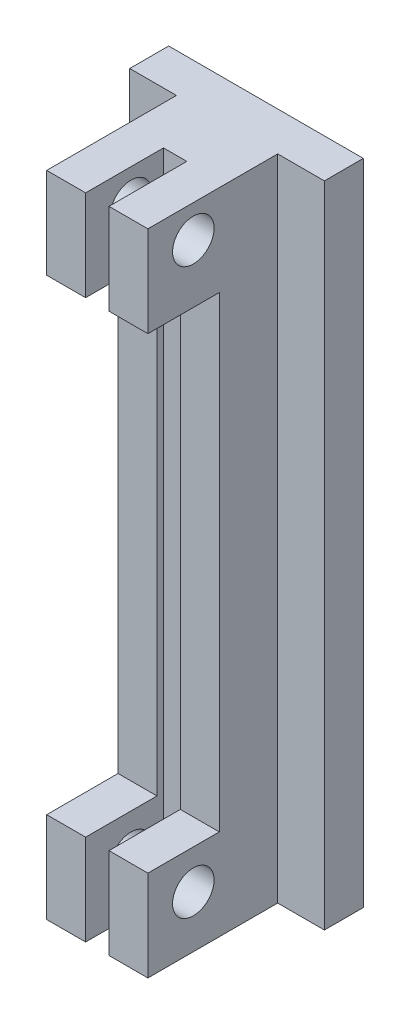
ISO-10303-21;
HEADER;
FILE_DESCRIPTION(('STEP AP214'),'2;1');
FILE_NAME('part.step','',(''),(''),'','','');
FILE_SCHEMA(('AUTOMOTIVE_DESIGN { 1 0 10303 214 1 1 1 1 }'));
ENDSEC;
DATA;
#1=APPLICATION_CONTEXT('core data for automotive mechanical design processes');
#2=APPLICATION_PROTOCOL_DEFINITION('international standard','automotive_design',2000,#1);
#3=PRODUCT_CONTEXT('',#1,'mechanical');
#4=PRODUCT('Part','Part','',(#3));
#5=PRODUCT_RELATED_PRODUCT_CATEGORY('part','',(#4));
#6=PRODUCT_DEFINITION_FORMATION('','',#4);
#7=PRODUCT_DEFINITION_CONTEXT('part definition',#1,'design');
#8=PRODUCT_DEFINITION('design','',#6,#7);
#9=PRODUCT_DEFINITION_SHAPE('','',#8);
#10=(LENGTH_UNIT() NAMED_UNIT(*) SI_UNIT(.MILLI.,.METRE.));
#11=(NAMED_UNIT(*) PLANE_ANGLE_UNIT() SI_UNIT($,.RADIAN.));
#12=(NAMED_UNIT(*) SI_UNIT($,.STERADIAN.) SOLID_ANGLE_UNIT());
#13=UNCERTAINTY_MEASURE_WITH_UNIT(LENGTH_MEASURE(1.E-05),#10,'distance_accuracy_value','');
#14=(GEOMETRIC_REPRESENTATION_CONTEXT(3) GLOBAL_UNCERTAINTY_ASSIGNED_CONTEXT((#13)) GLOBAL_UNIT_ASSIGNED_CONTEXT((#10,
#11,#12)) REPRESENTATION_CONTEXT('',''));
#15=CARTESIAN_POINT('',(0.,0.,0.));
#16=DIRECTION('',(0.,0.,1.));
#17=DIRECTION('',(1.,0.,0.));
#18=AXIS2_PLACEMENT_3D('',#15,#16,#17);
#19=CARTESIAN_POINT('',(-3.9,25.,13.));
#20=DIRECTION('',(0.,0.,-1.));
#21=DIRECTION('',(-1.,0.,0.));
#22=AXIS2_PLACEMENT_3D('',#19,#20,#21);
#23=PLANE('',#22);
#24=DIRECTION('',(0.,-1.,0.));
#25=VECTOR('',#24,1.);
#26=CARTESIAN_POINT('',(-0.900000000000001,25.,13.));
#27=LINE('',#26,#25);
#28=CARTESIAN_POINT('',(-0.900000000000001,-18.,13.));
#29=VERTEX_POINT('',#28);
#30=CARTESIAN_POINT('',(-0.900000000000001,-25.,13.));
#31=VERTEX_POINT('',#30);
#32=EDGE_CURVE('E412',#29,#31,#27,.T.);
#33=ORIENTED_EDGE('',*,*,#32,.F.);
#34=DIRECTION('',(-1.,0.,0.));
#35=VECTOR('',#34,1.);
#36=CARTESIAN_POINT('',(7.5,-18.,13.));
#37=LINE('',#36,#35);
#38=CARTESIAN_POINT('',(-3.89999999999999,-18.,13.));
#39=VERTEX_POINT('',#38);
#40=EDGE_CURVE('E270',#29,#39,#37,.T.);
#41=ORIENTED_EDGE('',*,*,#40,.T.);
#42=DIRECTION('',(0.,-1.,0.));
#43=VECTOR('',#42,1.);
#44=CARTESIAN_POINT('',(-3.9,25.,13.));
#45=LINE('',#44,#43);
#46=CARTESIAN_POINT('',(-3.9,-25.,13.));
#47=VERTEX_POINT('',#46);
#48=EDGE_CURVE('E215',#39,#47,#45,.T.);
#49=ORIENTED_EDGE('',*,*,#48,.T.);
#50=DIRECTION('',(1.,0.,0.));
#51=VECTOR('',#50,1.);
#52=CARTESIAN_POINT('',(-3.9,-25.,13.));
#53=LINE('',#52,#51);
#54=EDGE_CURVE('E352',#47,#31,#53,.T.);
#55=ORIENTED_EDGE('',*,*,#54,.T.);
#56=EDGE_LOOP('',(#33,#41,#49,#55));
#57=FACE_BOUND('',#56,.T.);
#58=ADVANCED_FACE('F45',(#57),#23,.F.);
#59=CARTESIAN_POINT('',(0.900000000000004,25.,13.));
#60=DIRECTION('',(0.,0.,-1.));
#61=DIRECTION('',(-1.,0.,0.));
#62=AXIS2_PLACEMENT_3D('',#59,#60,#61);
#63=PLANE('',#62);
#64=DIRECTION('',(0.,-1.,0.));
#65=VECTOR('',#64,1.);
#66=CARTESIAN_POINT('',(3.9,25.,13.));
#67=LINE('',#66,#65);
#68=CARTESIAN_POINT('',(3.9,-18.,13.));
#69=VERTEX_POINT('',#68);
#70=CARTESIAN_POINT('',(3.9,-25.,13.));
#71=VERTEX_POINT('',#70);
#72=EDGE_CURVE('E396',#69,#71,#67,.T.);
#73=ORIENTED_EDGE('',*,*,#72,.F.);
#74=CARTESIAN_POINT('',(0.900000000000004,-18.,13.));
#75=VERTEX_POINT('',#74);
#76=EDGE_CURVE('E274',#69,#75,#37,.T.);
#77=ORIENTED_EDGE('',*,*,#76,.T.);
#78=DIRECTION('',(0.,-1.,0.));
#79=VECTOR('',#78,1.);
#80=CARTESIAN_POINT('',(0.900000000000004,25.,13.));
#81=LINE('',#80,#79);
#82=CARTESIAN_POINT('',(0.900000000000004,-25.,13.));
#83=VERTEX_POINT('',#82);
#84=EDGE_CURVE('E401',#75,#83,#81,.T.);
#85=ORIENTED_EDGE('',*,*,#84,.T.);
#86=DIRECTION('',(1.,0.,0.));
#87=VECTOR('',#86,1.);
#88=CARTESIAN_POINT('',(0.900000000000004,-25.,13.));
#89=LINE('',#88,#87);
#90=EDGE_CURVE('E366',#83,#71,#89,.T.);
#91=ORIENTED_EDGE('',*,*,#90,.T.);
#92=EDGE_LOOP('',(#73,#77,#85,#91));
#93=FACE_BOUND('',#92,.T.);
#94=ADVANCED_FACE('F455',(#93),#63,.F.);
#95=CARTESIAN_POINT('',(-7.5,25.,0.));
#96=DIRECTION('',(1.,0.,0.));
#97=DIRECTION('',(0.,0.,-1.));
#98=AXIS2_PLACEMENT_3D('',#95,#96,#97);
#99=PLANE('',#98);
#100=DIRECTION('',(0.,0.,1.));
#101=VECTOR('',#100,1.);
#102=CARTESIAN_POINT('',(-7.5,-25.,0.));
#103=LINE('',#102,#101);
#104=CARTESIAN_POINT('',(-7.5,-25.,0.));
#105=VERTEX_POINT('',#104);
#106=CARTESIAN_POINT('',(-7.5,-25.,3.));
#107=VERTEX_POINT('',#106);
#108=EDGE_CURVE('E303',#105,#107,#103,.T.);
#109=ORIENTED_EDGE('',*,*,#108,.T.);
#110=DIRECTION('',(0.,-1.,0.));
#111=VECTOR('',#110,1.);
#112=CARTESIAN_POINT('',(-7.5,25.,3.));
#113=LINE('',#112,#111);
#114=CARTESIAN_POINT('',(-7.5,25.,3.));
#115=VERTEX_POINT('',#114);
#116=EDGE_CURVE('E220',#115,#107,#113,.T.);
#117=ORIENTED_EDGE('',*,*,#116,.F.);
#118=DIRECTION('',(0.,0.,1.));
#119=VECTOR('',#118,1.);
#120=CARTESIAN_POINT('',(-7.5,25.,0.));
#121=LINE('',#120,#119);
#122=CARTESIAN_POINT('',(-7.5,25.,0.));
#123=VERTEX_POINT('',#122);
#124=EDGE_CURVE('E304',#123,#115,#121,.T.);
#125=ORIENTED_EDGE('',*,*,#124,.F.);
#126=DIRECTION('',(0.,-1.,0.));
#127=VECTOR('',#126,1.);
#128=CARTESIAN_POINT('',(-7.5,25.,0.));
#129=LINE('',#128,#127);
#130=EDGE_CURVE('E341',#123,#105,#129,.T.);
#131=ORIENTED_EDGE('',*,*,#130,.T.);
#132=EDGE_LOOP('',(#109,#117,#125,#131));
#133=FACE_BOUND('',#132,.T.);
#134=ADVANCED_FACE('F47',(#133),#99,.F.);
#135=CARTESIAN_POINT('',(-7.5,25.,3.));
#136=DIRECTION('',(0.,0.,-1.));
#137=DIRECTION('',(-1.,0.,0.));
#138=AXIS2_PLACEMENT_3D('',#135,#136,#137);
#139=PLANE('',#138);
#140=DIRECTION('',(1.,0.,0.));
#141=VECTOR('',#140,1.);
#142=CARTESIAN_POINT('',(-7.5,-25.,3.));
#143=LINE('',#142,#141);
#144=CARTESIAN_POINT('',(-3.9,-25.,3.));
#145=VERTEX_POINT('',#144);
#146=EDGE_CURVE('E345',#107,#145,#143,.T.);
#147=ORIENTED_EDGE('',*,*,#146,.T.);
#148=DIRECTION('',(0.,-1.,0.));
#149=VECTOR('',#148,1.);
#150=CARTESIAN_POINT('',(-3.9,25.,3.));
#151=LINE('',#150,#149);
#152=CARTESIAN_POINT('',(-3.9,25.,3.));
#153=VERTEX_POINT('',#152);
#154=EDGE_CURVE('E214',#153,#145,#151,.T.);
#155=ORIENTED_EDGE('',*,*,#154,.F.);
#156=DIRECTION('',(1.,0.,0.));
#157=VECTOR('',#156,1.);
#158=CARTESIAN_POINT('',(-7.5,25.,3.));
#159=LINE('',#158,#157);
#160=EDGE_CURVE('E308',#115,#153,#159,.T.);
#161=ORIENTED_EDGE('',*,*,#160,.F.);
#162=ORIENTED_EDGE('',*,*,#116,.T.);
#163=EDGE_LOOP('',(#147,#155,#161,#162));
#164=FACE_BOUND('',#163,.T.);
#165=ADVANCED_FACE('F474',(#164),#139,.F.);
#166=CARTESIAN_POINT('',(-3.9,25.,3.));
#167=DIRECTION('',(1.,0.,0.));
#168=DIRECTION('',(0.,0.,-1.));
#169=AXIS2_PLACEMENT_3D('',#166,#167,#168);
#170=PLANE('',#169);
#171=CARTESIAN_POINT('',(-3.9,22.5,9.50000000000001));
#172=DIRECTION('',(-1.,0.,0.));
#173=DIRECTION('',(0.,0.,1.));
#174=AXIS2_PLACEMENT_3D('',#171,#172,#173);
#175=CIRCLE('',#174,1.6);
#176=CARTESIAN_POINT('',(-3.9,22.5,11.1));
#177=VERTEX_POINT('',#176);
#178=EDGE_CURVE('E239',#177,#177,#175,.T.);
#179=ORIENTED_EDGE('',*,*,#178,.F.);
#180=EDGE_LOOP('',(#179));
#181=FACE_BOUND('',#180,.T.);
#182=CARTESIAN_POINT('',(-3.9,-21.,9.50000000000001));
#183=DIRECTION('',(-1.,0.,0.));
#184=DIRECTION('',(0.,0.,1.));
#185=AXIS2_PLACEMENT_3D('',#182,#183,#184);
#186=CIRCLE('',#185,1.6);
#187=CARTESIAN_POINT('',(-3.9,-21.,11.1));
#188=VERTEX_POINT('',#187);
#189=EDGE_CURVE('E248',#188,#188,#186,.T.);
#190=ORIENTED_EDGE('',*,*,#189,.F.);
#191=EDGE_LOOP('',(#190));
#192=FACE_BOUND('',#191,.T.);
#193=ORIENTED_EDGE('',*,*,#48,.F.);
#194=DIRECTION('',(0.,0.,1.));
#195=VECTOR('',#194,1.);
#196=CARTESIAN_POINT('',(-3.89999999999999,-18.,13.));
#197=LINE('',#196,#195);
#198=CARTESIAN_POINT('',(-3.9,-18.,7.5));
#199=VERTEX_POINT('',#198);
#200=EDGE_CURVE('E196',#199,#39,#197,.T.);
#201=ORIENTED_EDGE('',*,*,#200,.F.);
#202=DIRECTION('',(0.,-1.,0.));
#203=VECTOR('',#202,1.);
#204=CARTESIAN_POINT('',(-3.9,-18.,7.5));
#205=LINE('',#204,#203);
#206=CARTESIAN_POINT('',(-3.9,18.,7.49999999999999));
#207=VERTEX_POINT('',#206);
#208=EDGE_CURVE('E207',#207,#199,#205,.T.);
#209=ORIENTED_EDGE('',*,*,#208,.F.);
#210=DIRECTION('',(0.,0.,-1.));
#211=VECTOR('',#210,1.);
#212=CARTESIAN_POINT('',(-3.89999999999999,18.,13.));
#213=LINE('',#212,#211);
#214=CARTESIAN_POINT('',(-3.89999999999999,18.,13.));
#215=VERTEX_POINT('',#214);
#216=EDGE_CURVE('E186',#215,#207,#213,.T.);
#217=ORIENTED_EDGE('',*,*,#216,.F.);
#218=CARTESIAN_POINT('',(-3.9,25.,13.));
#219=VERTEX_POINT('',#218);
#220=EDGE_CURVE('E203',#219,#215,#45,.T.);
#221=ORIENTED_EDGE('',*,*,#220,.F.);
#222=DIRECTION('',(0.,0.,1.));
#223=VECTOR('',#222,1.);
#224=CARTESIAN_POINT('',(-3.9,25.,3.));
#225=LINE('',#224,#223);
#226=EDGE_CURVE('E312',#153,#219,#225,.T.);
#227=ORIENTED_EDGE('',*,*,#226,.F.);
#228=ORIENTED_EDGE('',*,*,#154,.T.);
#229=DIRECTION('',(0.,0.,1.));
#230=VECTOR('',#229,1.);
#231=CARTESIAN_POINT('',(-3.9,-25.,3.));
#232=LINE('',#231,#230);
#233=EDGE_CURVE('E348',#145,#47,#232,.T.);
#234=ORIENTED_EDGE('',*,*,#233,.T.);
#235=EDGE_LOOP('',(#193,#201,#209,#217,#221,#227,#228,#234));
#236=FACE_BOUND('',#235,.T.);
#237=ADVANCED_FACE('F201',(#181,#192,#236),#170,.F.);
#238=ORIENTED_EDGE('',*,*,#220,.T.);
#239=DIRECTION('',(-1.,0.,0.));
#240=VECTOR('',#239,1.);
#241=CARTESIAN_POINT('',(7.5,18.,13.));
#242=LINE('',#241,#240);
#243=CARTESIAN_POINT('',(-0.900000000000001,18.,13.));
#244=VERTEX_POINT('',#243);
#245=EDGE_CURVE('E183',#244,#215,#242,.T.);
#246=ORIENTED_EDGE('',*,*,#245,.F.);
#247=CARTESIAN_POINT('',(-0.900000000000001,25.,13.));
#248=VERTEX_POINT('',#247);
#249=EDGE_CURVE('E222',#248,#244,#27,.T.);
#250=ORIENTED_EDGE('',*,*,#249,.F.);
#251=DIRECTION('',(1.,0.,0.));
#252=VECTOR('',#251,1.);
#253=CARTESIAN_POINT('',(-3.9,25.,13.));
#254=LINE('',#253,#252);
#255=EDGE_CURVE('E212',#219,#248,#254,.T.);
#256=ORIENTED_EDGE('',*,*,#255,.F.);
#257=EDGE_LOOP('',(#238,#246,#250,#256));
#258=FACE_BOUND('',#257,.T.);
#259=ADVANCED_FACE('F211',(#258),#23,.F.);
#260=CARTESIAN_POINT('',(-0.900000000000001,25.,13.));
#261=DIRECTION('',(-1.,0.,0.));
#262=DIRECTION('',(0.,0.,1.));
#263=AXIS2_PLACEMENT_3D('',#260,#261,#262);
#264=PLANE('',#263);
#265=CARTESIAN_POINT('',(-0.9,22.5,9.50000000000001));
#266=DIRECTION('',(-1.,0.,0.));
#267=DIRECTION('',(0.,0.,1.));
#268=AXIS2_PLACEMENT_3D('',#265,#266,#267);
#269=CIRCLE('',#268,1.6);
#270=CARTESIAN_POINT('',(-0.9,22.5,11.1));
#271=VERTEX_POINT('',#270);
#272=EDGE_CURVE('E209',#271,#271,#269,.T.);
#273=ORIENTED_EDGE('',*,*,#272,.T.);
#274=EDGE_LOOP('',(#273));
#275=FACE_BOUND('',#274,.T.);
#276=CARTESIAN_POINT('',(-0.9,-21.,9.50000000000001));
#277=DIRECTION('',(-1.,0.,0.));
#278=DIRECTION('',(0.,0.,1.));
#279=AXIS2_PLACEMENT_3D('',#276,#277,#278);
#280=CIRCLE('',#279,1.6);
#281=CARTESIAN_POINT('',(-0.9,-21.,11.1));
#282=VERTEX_POINT('',#281);
#283=EDGE_CURVE('E245',#282,#282,#280,.T.);
#284=ORIENTED_EDGE('',*,*,#283,.T.);
#285=EDGE_LOOP('',(#284));
#286=FACE_BOUND('',#285,.T.);
#287=DIRECTION('',(0.,-1.,0.));
#288=VECTOR('',#287,1.);
#289=CARTESIAN_POINT('',(-0.9,25.,7.49999999999999));
#290=LINE('',#289,#288);
#291=CARTESIAN_POINT('',(-0.9,18.,7.49999999999999));
#292=VERTEX_POINT('',#291);
#293=CARTESIAN_POINT('',(-0.9,-18.,7.5));
#294=VERTEX_POINT('',#293);
#295=EDGE_CURVE('E291',#292,#294,#290,.T.);
#296=ORIENTED_EDGE('',*,*,#295,.T.);
#297=DIRECTION('',(0.,0.,1.));
#298=VECTOR('',#297,1.);
#299=CARTESIAN_POINT('',(-0.900000000000001,-18.,13.));
#300=LINE('',#299,#298);
#301=EDGE_CURVE('E299',#294,#29,#300,.T.);
#302=ORIENTED_EDGE('',*,*,#301,.T.);
#303=ORIENTED_EDGE('',*,*,#32,.T.);
#304=DIRECTION('',(0.,0.,-1.));
#305=VECTOR('',#304,1.);
#306=CARTESIAN_POINT('',(-0.900000000000001,-25.,13.));
#307=LINE('',#306,#305);
#308=CARTESIAN_POINT('',(-0.9,-25.,7.));
#309=VERTEX_POINT('',#308);
#310=EDGE_CURVE('E356',#31,#309,#307,.T.);
#311=ORIENTED_EDGE('',*,*,#310,.T.);
#312=DIRECTION('',(0.,-1.,0.));
#313=VECTOR('',#312,1.);
#314=CARTESIAN_POINT('',(-0.9,25.,7.));
#315=LINE('',#314,#313);
#316=CARTESIAN_POINT('',(-0.9,25.,7.));
#317=VERTEX_POINT('',#316);
#318=EDGE_CURVE('E409',#317,#309,#315,.T.);
#319=ORIENTED_EDGE('',*,*,#318,.F.);
#320=DIRECTION('',(0.,0.,-1.));
#321=VECTOR('',#320,1.);
#322=CARTESIAN_POINT('',(-0.900000000000001,25.,13.));
#323=LINE('',#322,#321);
#324=EDGE_CURVE('E317',#248,#317,#323,.T.);
#325=ORIENTED_EDGE('',*,*,#324,.F.);
#326=ORIENTED_EDGE('',*,*,#249,.T.);
#327=DIRECTION('',(0.,0.,-1.));
#328=VECTOR('',#327,1.);
#329=CARTESIAN_POINT('',(-0.900000000000001,18.,13.));
#330=LINE('',#329,#328);
#331=EDGE_CURVE('E189',#244,#292,#330,.T.);
#332=ORIENTED_EDGE('',*,*,#331,.T.);
#333=EDGE_LOOP('',(#296,#302,#303,#311,#319,#325,#326,#332));
#334=FACE_BOUND('',#333,.T.);
#335=ADVANCED_FACE('F422',(#275,#286,#334),#264,.F.);
#336=CARTESIAN_POINT('',(-0.9,25.,7.));
#337=DIRECTION('',(0.,0.,-1.));
#338=DIRECTION('',(-1.,0.,0.));
#339=AXIS2_PLACEMENT_3D('',#336,#337,#338);
#340=PLANE('',#339);
#341=DIRECTION('',(1.,0.,0.));
#342=VECTOR('',#341,1.);
#343=CARTESIAN_POINT('',(-0.9,-25.,7.));
#344=LINE('',#343,#342);
#345=CARTESIAN_POINT('',(0.899999999999999,-25.,7.));
#346=VERTEX_POINT('',#345);
#347=EDGE_CURVE('E359',#309,#346,#344,.T.);
#348=ORIENTED_EDGE('',*,*,#347,.T.);
#349=DIRECTION('',(0.,-1.,0.));
#350=VECTOR('',#349,1.);
#351=CARTESIAN_POINT('',(0.899999999999999,25.,7.));
#352=LINE('',#351,#350);
#353=CARTESIAN_POINT('',(0.899999999999999,25.,7.));
#354=VERTEX_POINT('',#353);
#355=EDGE_CURVE('E406',#354,#346,#352,.T.);
#356=ORIENTED_EDGE('',*,*,#355,.F.);
#357=DIRECTION('',(1.,0.,0.));
#358=VECTOR('',#357,1.);
#359=CARTESIAN_POINT('',(-0.9,25.,7.));
#360=LINE('',#359,#358);
#361=EDGE_CURVE('E320',#317,#354,#360,.T.);
#362=ORIENTED_EDGE('',*,*,#361,.F.);
#363=ORIENTED_EDGE('',*,*,#318,.T.);
#364=EDGE_LOOP('',(#348,#356,#362,#363));
#365=FACE_BOUND('',#364,.T.);
#366=ADVANCED_FACE('F471',(#365),#340,.F.);
#367=CARTESIAN_POINT('',(0.899999999999999,25.,7.));
#368=DIRECTION('',(1.,0.,0.));
#369=DIRECTION('',(0.,0.,-1.));
#370=AXIS2_PLACEMENT_3D('',#367,#368,#369);
#371=PLANE('',#370);
#372=CARTESIAN_POINT('',(0.900000000000001,22.5,9.50000000000001));
#373=DIRECTION('',(1.,0.,0.));
#374=DIRECTION('',(0.,0.,-1.));
#375=AXIS2_PLACEMENT_3D('',#372,#373,#374);
#376=CIRCLE('',#375,1.6);
#377=CARTESIAN_POINT('',(0.9,22.5,7.9));
#378=VERTEX_POINT('',#377);
#379=EDGE_CURVE('E259',#378,#378,#376,.T.);
#380=ORIENTED_EDGE('',*,*,#379,.T.);
#381=EDGE_LOOP('',(#380));
#382=FACE_BOUND('',#381,.T.);
#383=CARTESIAN_POINT('',(0.900000000000001,-21.,9.50000000000001));
#384=DIRECTION('',(1.,0.,0.));
#385=DIRECTION('',(0.,0.,-1.));
#386=AXIS2_PLACEMENT_3D('',#383,#384,#385);
#387=CIRCLE('',#386,1.6);
#388=CARTESIAN_POINT('',(0.9,-21.,7.90000000000001));
#389=VERTEX_POINT('',#388);
#390=EDGE_CURVE('E238',#389,#389,#387,.T.);
#391=ORIENTED_EDGE('',*,*,#390,.T.);
#392=EDGE_LOOP('',(#391));
#393=FACE_BOUND('',#392,.T.);
#394=ORIENTED_EDGE('',*,*,#84,.F.);
#395=DIRECTION('',(0.,0.,-1.));
#396=VECTOR('',#395,1.);
#397=CARTESIAN_POINT('',(0.899999999999999,-18.,7.));
#398=LINE('',#397,#396);
#399=CARTESIAN_POINT('',(0.9,-18.,7.5));
#400=VERTEX_POINT('',#399);
#401=EDGE_CURVE('E295',#75,#400,#398,.T.);
#402=ORIENTED_EDGE('',*,*,#401,.T.);
#403=DIRECTION('',(0.,1.,0.));
#404=VECTOR('',#403,1.);
#405=CARTESIAN_POINT('',(0.9,25.,7.49999999999999));
#406=LINE('',#405,#404);
#407=CARTESIAN_POINT('',(0.900000000000001,18.,7.49999999999999));
#408=VERTEX_POINT('',#407);
#409=EDGE_CURVE('E287',#400,#408,#406,.T.);
#410=ORIENTED_EDGE('',*,*,#409,.T.);
#411=DIRECTION('',(0.,0.,1.));
#412=VECTOR('',#411,1.);
#413=CARTESIAN_POINT('',(0.899999999999999,18.,7.));
#414=LINE('',#413,#412);
#415=CARTESIAN_POINT('',(0.900000000000004,18.,13.));
#416=VERTEX_POINT('',#415);
#417=EDGE_CURVE('E281',#408,#416,#414,.T.);
#418=ORIENTED_EDGE('',*,*,#417,.T.);
#419=CARTESIAN_POINT('',(0.900000000000004,25.,13.));
#420=VERTEX_POINT('',#419);
#421=EDGE_CURVE('E402',#420,#416,#81,.T.);
#422=ORIENTED_EDGE('',*,*,#421,.F.);
#423=DIRECTION('',(0.,0.,1.));
#424=VECTOR('',#423,1.);
#425=CARTESIAN_POINT('',(0.899999999999999,25.,7.));
#426=LINE('',#425,#424);
#427=EDGE_CURVE('E323',#354,#420,#426,.T.);
#428=ORIENTED_EDGE('',*,*,#427,.F.);
#429=ORIENTED_EDGE('',*,*,#355,.T.);
#430=DIRECTION('',(0.,0.,1.));
#431=VECTOR('',#430,1.);
#432=CARTESIAN_POINT('',(0.899999999999999,-25.,7.));
#433=LINE('',#432,#431);
#434=EDGE_CURVE('E362',#346,#83,#433,.T.);
#435=ORIENTED_EDGE('',*,*,#434,.T.);
#436=EDGE_LOOP('',(#394,#402,#410,#418,#422,#428,#429,#435));
#437=FACE_BOUND('',#436,.T.);
#438=ADVANCED_FACE('F504',(#382,#393,#437),#371,.F.);
#439=ORIENTED_EDGE('',*,*,#421,.T.);
#440=CARTESIAN_POINT('',(3.9,18.,13.));
#441=VERTEX_POINT('',#440);
#442=EDGE_CURVE('E195',#441,#416,#242,.T.);
#443=ORIENTED_EDGE('',*,*,#442,.F.);
#444=CARTESIAN_POINT('',(3.9,25.,13.));
#445=VERTEX_POINT('',#444);
#446=EDGE_CURVE('E397',#445,#441,#67,.T.);
#447=ORIENTED_EDGE('',*,*,#446,.F.);
#448=DIRECTION('',(1.,0.,0.));
#449=VECTOR('',#448,1.);
#450=CARTESIAN_POINT('',(0.900000000000004,25.,13.));
#451=LINE('',#450,#449);
#452=EDGE_CURVE('E326',#420,#445,#451,.T.);
#453=ORIENTED_EDGE('',*,*,#452,.F.);
#454=EDGE_LOOP('',(#439,#443,#447,#453));
#455=FACE_BOUND('',#454,.T.);
#456=ADVANCED_FACE('F463',(#455),#63,.F.);
#457=CARTESIAN_POINT('',(3.9,25.,13.));
#458=DIRECTION('',(-1.,0.,0.));
#459=DIRECTION('',(0.,0.,1.));
#460=AXIS2_PLACEMENT_3D('',#457,#458,#459);
#461=PLANE('',#460);
#462=CARTESIAN_POINT('',(3.9,22.5,9.50000000000001));
#463=DIRECTION('',(-1.,0.,0.));
#464=DIRECTION('',(0.,0.,1.));
#465=AXIS2_PLACEMENT_3D('',#462,#463,#464);
#466=CIRCLE('',#465,1.6);
#467=CARTESIAN_POINT('',(3.9,22.5,11.1));
#468=VERTEX_POINT('',#467);
#469=EDGE_CURVE('E49',#468,#468,#466,.T.);
#470=ORIENTED_EDGE('',*,*,#469,.T.);
#471=EDGE_LOOP('',(#470));
#472=FACE_BOUND('',#471,.T.);
#473=CARTESIAN_POINT('',(3.9,-21.,9.50000000000001));
#474=DIRECTION('',(-1.,0.,0.));
#475=DIRECTION('',(0.,0.,1.));
#476=AXIS2_PLACEMENT_3D('',#473,#474,#475);
#477=CIRCLE('',#476,1.6);
#478=CARTESIAN_POINT('',(3.9,-21.,11.1));
#479=VERTEX_POINT('',#478);
#480=EDGE_CURVE('E235',#479,#479,#477,.T.);
#481=ORIENTED_EDGE('',*,*,#480,.T.);
#482=EDGE_LOOP('',(#481));
#483=FACE_BOUND('',#482,.T.);
#484=DIRECTION('',(0.,-1.,0.));
#485=VECTOR('',#484,1.);
#486=CARTESIAN_POINT('',(3.9,25.,7.49999999999999));
#487=LINE('',#486,#485);
#488=CARTESIAN_POINT('',(3.9,18.,7.49999999999999));
#489=VERTEX_POINT('',#488);
#490=CARTESIAN_POINT('',(3.9,-18.,7.5));
#491=VERTEX_POINT('',#490);
#492=EDGE_CURVE('E55',#489,#491,#487,.T.);
#493=ORIENTED_EDGE('',*,*,#492,.T.);
#494=DIRECTION('',(0.,0.,1.));
#495=VECTOR('',#494,1.);
#496=CARTESIAN_POINT('',(3.9,-18.,13.));
#497=LINE('',#496,#495);
#498=EDGE_CURVE('E11',#491,#69,#497,.T.);
#499=ORIENTED_EDGE('',*,*,#498,.T.);
#500=ORIENTED_EDGE('',*,*,#72,.T.);
#501=DIRECTION('',(0.,0.,-1.));
#502=VECTOR('',#501,1.);
#503=CARTESIAN_POINT('',(3.9,-25.,13.));
#504=LINE('',#503,#502);
#505=CARTESIAN_POINT('',(3.9,-25.,3.));
#506=VERTEX_POINT('',#505);
#507=EDGE_CURVE('E370',#71,#506,#504,.T.);
#508=ORIENTED_EDGE('',*,*,#507,.T.);
#509=DIRECTION('',(0.,-1.,0.));
#510=VECTOR('',#509,1.);
#511=CARTESIAN_POINT('',(3.9,25.,3.));
#512=LINE('',#511,#510);
#513=CARTESIAN_POINT('',(3.9,25.,3.));
#514=VERTEX_POINT('',#513);
#515=EDGE_CURVE('E392',#514,#506,#512,.T.);
#516=ORIENTED_EDGE('',*,*,#515,.F.);
#517=DIRECTION('',(0.,0.,-1.));
#518=VECTOR('',#517,1.);
#519=CARTESIAN_POINT('',(3.9,25.,13.));
#520=LINE('',#519,#518);
#521=EDGE_CURVE('E329',#445,#514,#520,.T.);
#522=ORIENTED_EDGE('',*,*,#521,.F.);
#523=ORIENTED_EDGE('',*,*,#446,.T.);
#524=DIRECTION('',(0.,0.,-1.));
#525=VECTOR('',#524,1.);
#526=CARTESIAN_POINT('',(3.9,18.,13.));
#527=LINE('',#526,#525);
#528=EDGE_CURVE('E229',#441,#489,#527,.T.);
#529=ORIENTED_EDGE('',*,*,#528,.T.);
#530=EDGE_LOOP('',(#493,#499,#500,#508,#516,#522,#523,#529));
#531=FACE_BOUND('',#530,.T.);
#532=ADVANCED_FACE('F524',(#472,#483,#531),#461,.F.);
#533=CARTESIAN_POINT('',(3.9,25.,3.));
#534=DIRECTION('',(0.,0.,-1.));
#535=DIRECTION('',(-1.,0.,0.));
#536=AXIS2_PLACEMENT_3D('',#533,#534,#535);
#537=PLANE('',#536);
#538=DIRECTION('',(1.,0.,0.));
#539=VECTOR('',#538,1.);
#540=CARTESIAN_POINT('',(3.9,-25.,3.));
#541=LINE('',#540,#539);
#542=CARTESIAN_POINT('',(7.5,-25.,3.00000000000001));
#543=VERTEX_POINT('',#542);
#544=EDGE_CURVE('E373',#506,#543,#541,.T.);
#545=ORIENTED_EDGE('',*,*,#544,.T.);
#546=DIRECTION('',(0.,-1.,0.));
#547=VECTOR('',#546,1.);
#548=CARTESIAN_POINT('',(7.5,25.,3.00000000000001));
#549=LINE('',#548,#547);
#550=CARTESIAN_POINT('',(7.5,25.,3.00000000000001));
#551=VERTEX_POINT('',#550);
#552=EDGE_CURVE('E388',#551,#543,#549,.T.);
#553=ORIENTED_EDGE('',*,*,#552,.F.);
#554=DIRECTION('',(1.,0.,0.));
#555=VECTOR('',#554,1.);
#556=CARTESIAN_POINT('',(3.9,25.,3.));
#557=LINE('',#556,#555);
#558=EDGE_CURVE('E332',#514,#551,#557,.T.);
#559=ORIENTED_EDGE('',*,*,#558,.F.);
#560=ORIENTED_EDGE('',*,*,#515,.T.);
#561=EDGE_LOOP('',(#545,#553,#559,#560));
#562=FACE_BOUND('',#561,.T.);
#563=ADVANCED_FACE('F527',(#562),#537,.F.);
#564=CARTESIAN_POINT('',(7.5,25.,3.00000000000001));
#565=DIRECTION('',(-1.,0.,0.));
#566=DIRECTION('',(0.,0.,1.));
#567=AXIS2_PLACEMENT_3D('',#564,#565,#566);
#568=PLANE('',#567);
#569=DIRECTION('',(0.,0.,-1.));
#570=VECTOR('',#569,1.);
#571=CARTESIAN_POINT('',(7.5,-25.,3.00000000000001));
#572=LINE('',#571,#570);
#573=CARTESIAN_POINT('',(7.5,-25.,0.));
#574=VERTEX_POINT('',#573);
#575=EDGE_CURVE('E376',#543,#574,#572,.T.);
#576=ORIENTED_EDGE('',*,*,#575,.T.);
#577=DIRECTION('',(0.,-1.,0.));
#578=VECTOR('',#577,1.);
#579=CARTESIAN_POINT('',(7.5,25.,0.));
#580=LINE('',#579,#578);
#581=CARTESIAN_POINT('',(7.5,25.,0.));
#582=VERTEX_POINT('',#581);
#583=EDGE_CURVE('E384',#582,#574,#580,.T.);
#584=ORIENTED_EDGE('',*,*,#583,.F.);
#585=DIRECTION('',(0.,0.,-1.));
#586=VECTOR('',#585,1.);
#587=CARTESIAN_POINT('',(7.5,25.,3.00000000000001));
#588=LINE('',#587,#586);
#589=EDGE_CURVE('E335',#551,#582,#588,.T.);
#590=ORIENTED_EDGE('',*,*,#589,.F.);
#591=ORIENTED_EDGE('',*,*,#552,.T.);
#592=EDGE_LOOP('',(#576,#584,#590,#591));
#593=FACE_BOUND('',#592,.T.);
#594=ADVANCED_FACE('F544',(#593),#568,.F.);
#595=CARTESIAN_POINT('',(7.5,25.,0.));
#596=DIRECTION('',(0.,0.,1.));
#597=DIRECTION('',(1.,0.,0.));
#598=AXIS2_PLACEMENT_3D('',#595,#596,#597);
#599=PLANE('',#598);
#600=DIRECTION('',(-1.,0.,0.));
#601=VECTOR('',#600,1.);
#602=CARTESIAN_POINT('',(7.5,-25.,0.));
#603=LINE('',#602,#601);
#604=EDGE_CURVE('E309',#574,#105,#603,.T.);
#605=ORIENTED_EDGE('',*,*,#604,.T.);
#606=ORIENTED_EDGE('',*,*,#130,.F.);
#607=DIRECTION('',(-1.,0.,0.));
#608=VECTOR('',#607,1.);
#609=CARTESIAN_POINT('',(7.5,25.,0.));
#610=LINE('',#609,#608);
#611=EDGE_CURVE('E338',#582,#123,#610,.T.);
#612=ORIENTED_EDGE('',*,*,#611,.F.);
#613=ORIENTED_EDGE('',*,*,#583,.T.);
#614=EDGE_LOOP('',(#605,#606,#612,#613));
#615=FACE_BOUND('',#614,.T.);
#616=ADVANCED_FACE('F548',(#615),#599,.F.);
#617=CARTESIAN_POINT('',(0.,25.,0.));
#618=DIRECTION('',(0.,1.,0.));
#619=DIRECTION('',(0.,0.,1.));
#620=AXIS2_PLACEMENT_3D('',#617,#618,#619);
#621=PLANE('',#620);
#622=ORIENTED_EDGE('',*,*,#124,.T.);
#623=ORIENTED_EDGE('',*,*,#160,.T.);
#624=ORIENTED_EDGE('',*,*,#226,.T.);
#625=ORIENTED_EDGE('',*,*,#255,.T.);
#626=ORIENTED_EDGE('',*,*,#324,.T.);
#627=ORIENTED_EDGE('',*,*,#361,.T.);
#628=ORIENTED_EDGE('',*,*,#427,.T.);
#629=ORIENTED_EDGE('',*,*,#452,.T.);
#630=ORIENTED_EDGE('',*,*,#521,.T.);
#631=ORIENTED_EDGE('',*,*,#558,.T.);
#632=ORIENTED_EDGE('',*,*,#589,.T.);
#633=ORIENTED_EDGE('',*,*,#611,.T.);
#634=EDGE_LOOP('',(#622,#623,#624,#625,#626,#627,#628,#629,#630,#631,#632,#633));
#635=FACE_BOUND('',#634,.T.);
#636=ADVANCED_FACE('F424',(#635),#621,.T.);
#637=CARTESIAN_POINT('',(0.,-25.,0.));
#638=DIRECTION('',(0.,1.,0.));
#639=DIRECTION('',(0.,0.,1.));
#640=AXIS2_PLACEMENT_3D('',#637,#638,#639);
#641=PLANE('',#640);
#642=ORIENTED_EDGE('',*,*,#108,.F.);
#643=ORIENTED_EDGE('',*,*,#604,.F.);
#644=ORIENTED_EDGE('',*,*,#575,.F.);
#645=ORIENTED_EDGE('',*,*,#544,.F.);
#646=ORIENTED_EDGE('',*,*,#507,.F.);
#647=ORIENTED_EDGE('',*,*,#90,.F.);
#648=ORIENTED_EDGE('',*,*,#434,.F.);
#649=ORIENTED_EDGE('',*,*,#347,.F.);
#650=ORIENTED_EDGE('',*,*,#310,.F.);
#651=ORIENTED_EDGE('',*,*,#54,.F.);
#652=ORIENTED_EDGE('',*,*,#233,.F.);
#653=ORIENTED_EDGE('',*,*,#146,.F.);
#654=EDGE_LOOP('',(#642,#643,#644,#645,#646,#647,#648,#649,#650,#651,#652,#653));
#655=FACE_BOUND('',#654,.T.);
#656=ADVANCED_FACE('F432',(#655),#641,.F.);
#657=CARTESIAN_POINT('',(7.5,18.,13.));
#658=DIRECTION('',(0.,1.,0.));
#659=DIRECTION('',(0.,0.,1.));
#660=AXIS2_PLACEMENT_3D('',#657,#658,#659);
#661=PLANE('',#660);
#662=DIRECTION('',(-1.,0.,0.));
#663=VECTOR('',#662,1.);
#664=CARTESIAN_POINT('',(7.5,18.,7.49999999999999));
#665=LINE('',#664,#663);
#666=EDGE_CURVE('E71',#489,#408,#665,.T.);
#667=ORIENTED_EDGE('',*,*,#666,.F.);
#668=ORIENTED_EDGE('',*,*,#528,.F.);
#669=ORIENTED_EDGE('',*,*,#442,.T.);
#670=ORIENTED_EDGE('',*,*,#417,.F.);
#671=EDGE_LOOP('',(#667,#668,#669,#670));
#672=FACE_BOUND('',#671,.T.);
#673=ADVANCED_FACE('F449',(#672),#661,.F.);
#674=CARTESIAN_POINT('',(7.5,-18.,7.5));
#675=DIRECTION('',(0.,0.,-1.));
#676=DIRECTION('',(-1.,0.,0.));
#677=AXIS2_PLACEMENT_3D('',#674,#675,#676);
#678=PLANE('',#677);
#679=DIRECTION('',(-1.,0.,0.));
#680=VECTOR('',#679,1.);
#681=CARTESIAN_POINT('',(7.5,-18.,7.5));
#682=LINE('',#681,#680);
#683=EDGE_CURVE('E275',#491,#400,#682,.T.);
#684=ORIENTED_EDGE('',*,*,#683,.F.);
#685=ORIENTED_EDGE('',*,*,#492,.F.);
#686=ORIENTED_EDGE('',*,*,#666,.T.);
#687=ORIENTED_EDGE('',*,*,#409,.F.);
#688=EDGE_LOOP('',(#684,#685,#686,#687));
#689=FACE_BOUND('',#688,.T.);
#690=ADVANCED_FACE('F442',(#689),#678,.F.);
#691=CARTESIAN_POINT('',(7.5,-18.,13.));
#692=DIRECTION('',(0.,-1.,0.));
#693=DIRECTION('',(0.,0.,-1.));
#694=AXIS2_PLACEMENT_3D('',#691,#692,#693);
#695=PLANE('',#694);
#696=ORIENTED_EDGE('',*,*,#76,.F.);
#697=ORIENTED_EDGE('',*,*,#498,.F.);
#698=ORIENTED_EDGE('',*,*,#683,.T.);
#699=ORIENTED_EDGE('',*,*,#401,.F.);
#700=EDGE_LOOP('',(#696,#697,#698,#699));
#701=FACE_BOUND('',#700,.T.);
#702=ADVANCED_FACE('F450',(#701),#695,.F.);
#703=EDGE_CURVE('E276',#294,#199,#682,.T.);
#704=ORIENTED_EDGE('',*,*,#703,.T.);
#705=ORIENTED_EDGE('',*,*,#200,.T.);
#706=ORIENTED_EDGE('',*,*,#40,.F.);
#707=ORIENTED_EDGE('',*,*,#301,.F.);
#708=EDGE_LOOP('',(#704,#705,#706,#707));
#709=FACE_BOUND('',#708,.T.);
#710=ADVANCED_FACE('F436',(#709),#695,.F.);
#711=EDGE_CURVE('E63',#292,#207,#665,.T.);
#712=ORIENTED_EDGE('',*,*,#711,.T.);
#713=ORIENTED_EDGE('',*,*,#208,.T.);
#714=ORIENTED_EDGE('',*,*,#703,.F.);
#715=ORIENTED_EDGE('',*,*,#295,.F.);
#716=EDGE_LOOP('',(#712,#713,#714,#715));
#717=FACE_BOUND('',#716,.T.);
#718=ADVANCED_FACE('F439',(#717),#678,.F.);
#719=ORIENTED_EDGE('',*,*,#245,.T.);
#720=ORIENTED_EDGE('',*,*,#216,.T.);
#721=ORIENTED_EDGE('',*,*,#711,.F.);
#722=ORIENTED_EDGE('',*,*,#331,.F.);
#723=EDGE_LOOP('',(#719,#720,#721,#722));
#724=FACE_BOUND('',#723,.T.);
#725=ADVANCED_FACE('F185',(#724),#661,.F.);
#726=CARTESIAN_POINT('',(7.5,-21.,9.50000000000001));
#727=DIRECTION('',(-1.,0.,0.));
#728=DIRECTION('',(0.,0.,1.));
#729=AXIS2_PLACEMENT_3D('',#726,#727,#728);
#730=CYLINDRICAL_SURFACE('',#729,1.6);
#731=ORIENTED_EDGE('',*,*,#480,.F.);
#732=EDGE_LOOP('',(#731));
#733=FACE_BOUND('',#732,.T.);
#734=ORIENTED_EDGE('',*,*,#390,.F.);
#735=EDGE_LOOP('',(#734));
#736=FACE_BOUND('',#735,.T.);
#737=ADVANCED_FACE('F447',(#733,#736),#730,.F.);
#738=CARTESIAN_POINT('',(7.5,22.5,9.50000000000001));
#739=DIRECTION('',(-1.,0.,0.));
#740=DIRECTION('',(0.,0.,1.));
#741=AXIS2_PLACEMENT_3D('',#738,#739,#740);
#742=CYLINDRICAL_SURFACE('',#741,1.6);
#743=ORIENTED_EDGE('',*,*,#469,.F.);
#744=EDGE_LOOP('',(#743));
#745=FACE_BOUND('',#744,.T.);
#746=ORIENTED_EDGE('',*,*,#379,.F.);
#747=EDGE_LOOP('',(#746));
#748=FACE_BOUND('',#747,.T.);
#749=ADVANCED_FACE('F486',(#745,#748),#742,.F.);
#750=ORIENTED_EDGE('',*,*,#189,.T.);
#751=EDGE_LOOP('',(#750));
#752=FACE_BOUND('',#751,.T.);
#753=ORIENTED_EDGE('',*,*,#283,.F.);
#754=EDGE_LOOP('',(#753));
#755=FACE_BOUND('',#754,.T.);
#756=ADVANCED_FACE('F482',(#752,#755),#730,.F.);
#757=ORIENTED_EDGE('',*,*,#178,.T.);
#758=EDGE_LOOP('',(#757));
#759=FACE_BOUND('',#758,.T.);
#760=ORIENTED_EDGE('',*,*,#272,.F.);
#761=EDGE_LOOP('',(#760));
#762=FACE_BOUND('',#761,.T.);
#763=ADVANCED_FACE('F485',(#759,#762),#742,.F.);
#764=CLOSED_SHELL('',(#58,#94,#134,#165,#237,#259,#335,#366,#438,#456,#532,#563,#594,#616,#636,
#656,#673,#690,#702,#710,#718,#725,#737,#749,#756,#763));
#765=MANIFOLD_SOLID_BREP('B2',#764);
#766=ADVANCED_BREP_SHAPE_REPRESENTATION('',(#18,#765),#14);
#767=SHAPE_DEFINITION_REPRESENTATION(#9,#766);
ENDSEC;
END-ISO-10303-21;
